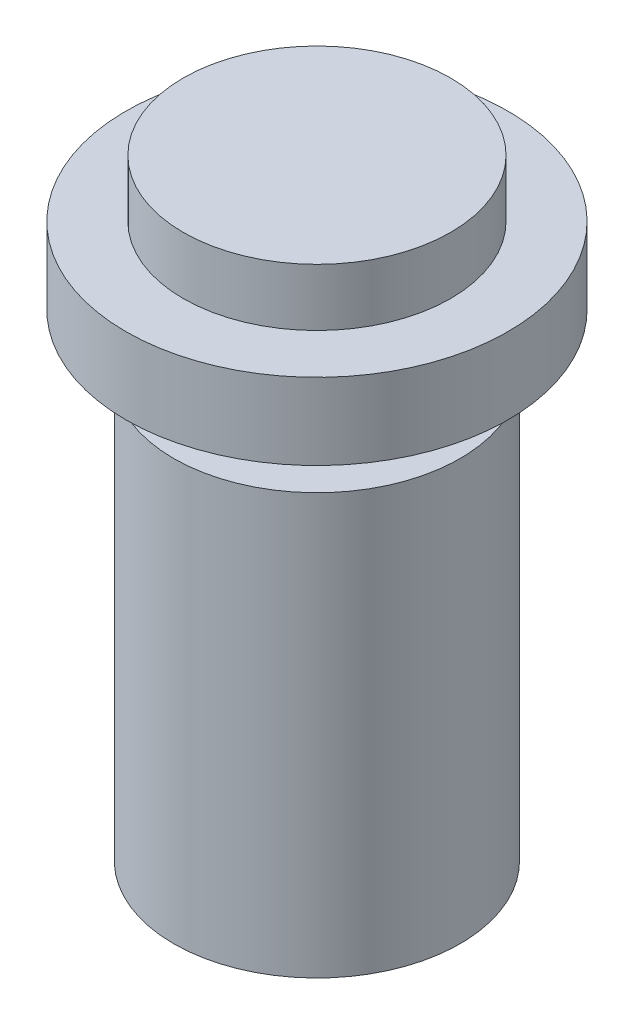
ISO-10303-21;
HEADER;
FILE_DESCRIPTION(('STEP AP214'),'2;1');
FILE_NAME('part.step','',(''),(''),'','','');
FILE_SCHEMA(('AUTOMOTIVE_DESIGN { 1 0 10303 214 1 1 1 1 }'));
ENDSEC;
DATA;
#1=APPLICATION_CONTEXT('core data for automotive mechanical design processes');
#2=APPLICATION_PROTOCOL_DEFINITION('international standard','automotive_design',2000,#1);
#3=PRODUCT_CONTEXT('',#1,'mechanical');
#4=PRODUCT('Part','Part','',(#3));
#5=PRODUCT_RELATED_PRODUCT_CATEGORY('part','',(#4));
#6=PRODUCT_DEFINITION_FORMATION('','',#4);
#7=PRODUCT_DEFINITION_CONTEXT('part definition',#1,'design');
#8=PRODUCT_DEFINITION('design','',#6,#7);
#9=PRODUCT_DEFINITION_SHAPE('','',#8);
#10=(LENGTH_UNIT() NAMED_UNIT(*) SI_UNIT(.MILLI.,.METRE.));
#11=(NAMED_UNIT(*) PLANE_ANGLE_UNIT() SI_UNIT($,.RADIAN.));
#12=(NAMED_UNIT(*) SI_UNIT($,.STERADIAN.) SOLID_ANGLE_UNIT());
#13=UNCERTAINTY_MEASURE_WITH_UNIT(LENGTH_MEASURE(1.E-05),#10,'distance_accuracy_value','');
#14=(GEOMETRIC_REPRESENTATION_CONTEXT(3) GLOBAL_UNCERTAINTY_ASSIGNED_CONTEXT((#13)) GLOBAL_UNIT_ASSIGNED_CONTEXT((#10,
#11,#12)) REPRESENTATION_CONTEXT('',''));
#15=CARTESIAN_POINT('',(0.,0.,0.));
#16=DIRECTION('',(0.,0.,1.));
#17=DIRECTION('',(1.,0.,0.));
#18=AXIS2_PLACEMENT_3D('',#15,#16,#17);
#19=CARTESIAN_POINT('',(0.,22.,0.));
#20=DIRECTION('',(0.,-1.,0.));
#21=DIRECTION('',(0.,0.,-1.));
#22=AXIS2_PLACEMENT_3D('',#19,#20,#21);
#23=CYLINDRICAL_SURFACE('',#22,7.5);
#24=CARTESIAN_POINT('',(0.,22.,0.));
#25=DIRECTION('',(0.,1.,0.));
#26=DIRECTION('',(0.,0.,1.));
#27=AXIS2_PLACEMENT_3D('',#24,#25,#26);
#28=CIRCLE('',#27,7.5);
#29=CARTESIAN_POINT('',(0.,22.,7.5));
#30=VERTEX_POINT('',#29);
#31=EDGE_CURVE('E11',#30,#30,#28,.T.);
#32=ORIENTED_EDGE('',*,*,#31,.F.);
#33=EDGE_LOOP('',(#32));
#34=FACE_BOUND('',#33,.T.);
#35=CARTESIAN_POINT('',(0.,0.,0.));
#36=DIRECTION('',(0.,1.,0.));
#37=DIRECTION('',(0.,0.,1.));
#38=AXIS2_PLACEMENT_3D('',#35,#36,#37);
#39=CIRCLE('',#38,7.5);
#40=CARTESIAN_POINT('',(0.,0.,7.5));
#41=VERTEX_POINT('',#40);
#42=EDGE_CURVE('E55',#41,#41,#39,.T.);
#43=ORIENTED_EDGE('',*,*,#42,.T.);
#44=EDGE_LOOP('',(#43));
#45=FACE_BOUND('',#44,.T.);
#46=ADVANCED_FACE('F47',(#34,#45),#23,.T.);
#47=CARTESIAN_POINT('',(0.,22.,0.));
#48=DIRECTION('',(0.,1.,0.));
#49=DIRECTION('',(0.,0.,1.));
#50=AXIS2_PLACEMENT_3D('',#47,#48,#49);
#51=PLANE('',#50);
#52=ORIENTED_EDGE('',*,*,#31,.T.);
#53=EDGE_LOOP('',(#52));
#54=FACE_BOUND('',#53,.T.);
#55=ADVANCED_FACE('F61',(#54),#51,.T.);
#56=CARTESIAN_POINT('',(0.,0.,0.));
#57=DIRECTION('',(0.,1.,0.));
#58=DIRECTION('',(0.,0.,1.));
#59=AXIS2_PLACEMENT_3D('',#56,#57,#58);
#60=PLANE('',#59);
#61=ORIENTED_EDGE('',*,*,#42,.F.);
#62=EDGE_LOOP('',(#61));
#63=FACE_BOUND('',#62,.T.);
#64=ADVANCED_FACE('F65',(#63),#60,.F.);
#65=CLOSED_SHELL('',(#46,#55,#64));
#66=MANIFOLD_SOLID_BREP('B2',#65);
#67=CARTESIAN_POINT('',(0.,29.,0.));
#68=DIRECTION('',(0.,-1.,0.));
#69=DIRECTION('',(0.,0.,-1.));
#70=AXIS2_PLACEMENT_3D('',#67,#68,#69);
#71=CYLINDRICAL_SURFACE('',#70,10.);
#72=CARTESIAN_POINT('',(0.,29.,0.));
#73=DIRECTION('',(0.,1.,0.));
#74=DIRECTION('',(0.,0.,1.));
#75=AXIS2_PLACEMENT_3D('',#72,#73,#74);
#76=CIRCLE('',#75,10.);
#77=CARTESIAN_POINT('',(0.,29.,10.));
#78=VERTEX_POINT('',#77);
#79=EDGE_CURVE('E108',#78,#78,#76,.T.);
#80=ORIENTED_EDGE('',*,*,#79,.F.);
#81=EDGE_LOOP('',(#80));
#82=FACE_BOUND('',#81,.T.);
#83=CARTESIAN_POINT('',(0.,25.,0.));
#84=DIRECTION('',(0.,1.,0.));
#85=DIRECTION('',(0.,0.,1.));
#86=AXIS2_PLACEMENT_3D('',#83,#84,#85);
#87=CIRCLE('',#86,10.);
#88=CARTESIAN_POINT('',(0.,25.,10.));
#89=VERTEX_POINT('',#88);
#90=EDGE_CURVE('E104',#89,#89,#87,.T.);
#91=ORIENTED_EDGE('',*,*,#90,.T.);
#92=EDGE_LOOP('',(#91));
#93=FACE_BOUND('',#92,.T.);
#94=ADVANCED_FACE('F105',(#82,#93),#71,.T.);
#95=CARTESIAN_POINT('',(0.,29.,0.));
#96=DIRECTION('',(0.,1.,0.));
#97=DIRECTION('',(0.,0.,1.));
#98=AXIS2_PLACEMENT_3D('',#95,#96,#97);
#99=PLANE('',#98);
#100=CARTESIAN_POINT('',(0.,29.,0.));
#101=DIRECTION('',(0.,1.,0.));
#102=DIRECTION('',(0.,0.,1.));
#103=AXIS2_PLACEMENT_3D('',#100,#101,#102);
#104=CIRCLE('',#103,7.);
#105=CARTESIAN_POINT('',(0.,29.,7.));
#106=VERTEX_POINT('',#105);
#107=EDGE_CURVE('E48',#106,#106,#104,.T.);
#108=ORIENTED_EDGE('',*,*,#107,.F.);
#109=EDGE_LOOP('',(#108));
#110=FACE_BOUND('',#109,.T.);
#111=ORIENTED_EDGE('',*,*,#79,.T.);
#112=EDGE_LOOP('',(#111));
#113=FACE_BOUND('',#112,.T.);
#114=ADVANCED_FACE('F127',(#110,#113),#99,.T.);
#115=CARTESIAN_POINT('',(0.,25.,0.));
#116=DIRECTION('',(0.,1.,0.));
#117=DIRECTION('',(0.,0.,1.));
#118=AXIS2_PLACEMENT_3D('',#115,#116,#117);
#119=PLANE('',#118);
#120=ORIENTED_EDGE('',*,*,#90,.F.);
#121=EDGE_LOOP('',(#120));
#122=FACE_BOUND('',#121,.T.);
#123=ADVANCED_FACE('F123',(#122),#119,.F.);
#124=CARTESIAN_POINT('',(0.,32.,0.));
#125=DIRECTION('',(0.,-1.,0.));
#126=DIRECTION('',(0.,0.,-1.));
#127=AXIS2_PLACEMENT_3D('',#124,#125,#126);
#128=CYLINDRICAL_SURFACE('',#127,7.);
#129=CARTESIAN_POINT('',(0.,32.,0.));
#130=DIRECTION('',(0.,1.,0.));
#131=DIRECTION('',(0.,0.,1.));
#132=AXIS2_PLACEMENT_3D('',#129,#130,#131);
#133=CIRCLE('',#132,7.);
#134=CARTESIAN_POINT('',(0.,32.,7.));
#135=VERTEX_POINT('',#134);
#136=EDGE_CURVE('E113',#135,#135,#133,.T.);
#137=ORIENTED_EDGE('',*,*,#136,.F.);
#138=EDGE_LOOP('',(#137));
#139=FACE_BOUND('',#138,.T.);
#140=ORIENTED_EDGE('',*,*,#107,.T.);
#141=EDGE_LOOP('',(#140));
#142=FACE_BOUND('',#141,.T.);
#143=ADVANCED_FACE('F121',(#139,#142),#128,.T.);
#144=CARTESIAN_POINT('',(0.,32.,0.));
#145=DIRECTION('',(0.,1.,0.));
#146=DIRECTION('',(0.,0.,1.));
#147=AXIS2_PLACEMENT_3D('',#144,#145,#146);
#148=PLANE('',#147);
#149=ORIENTED_EDGE('',*,*,#136,.T.);
#150=EDGE_LOOP('',(#149));
#151=FACE_BOUND('',#150,.T.);
#152=ADVANCED_FACE('F132',(#151),#148,.T.);
#153=CLOSED_SHELL('',(#94,#114,#123,#143,#152));
#154=MANIFOLD_SOLID_BREP('B6',#153);
#155=ADVANCED_BREP_SHAPE_REPRESENTATION('',(#18,#66,#154),#14);
#156=SHAPE_DEFINITION_REPRESENTATION(#9,#155);
ENDSEC;
END-ISO-10303-21;
